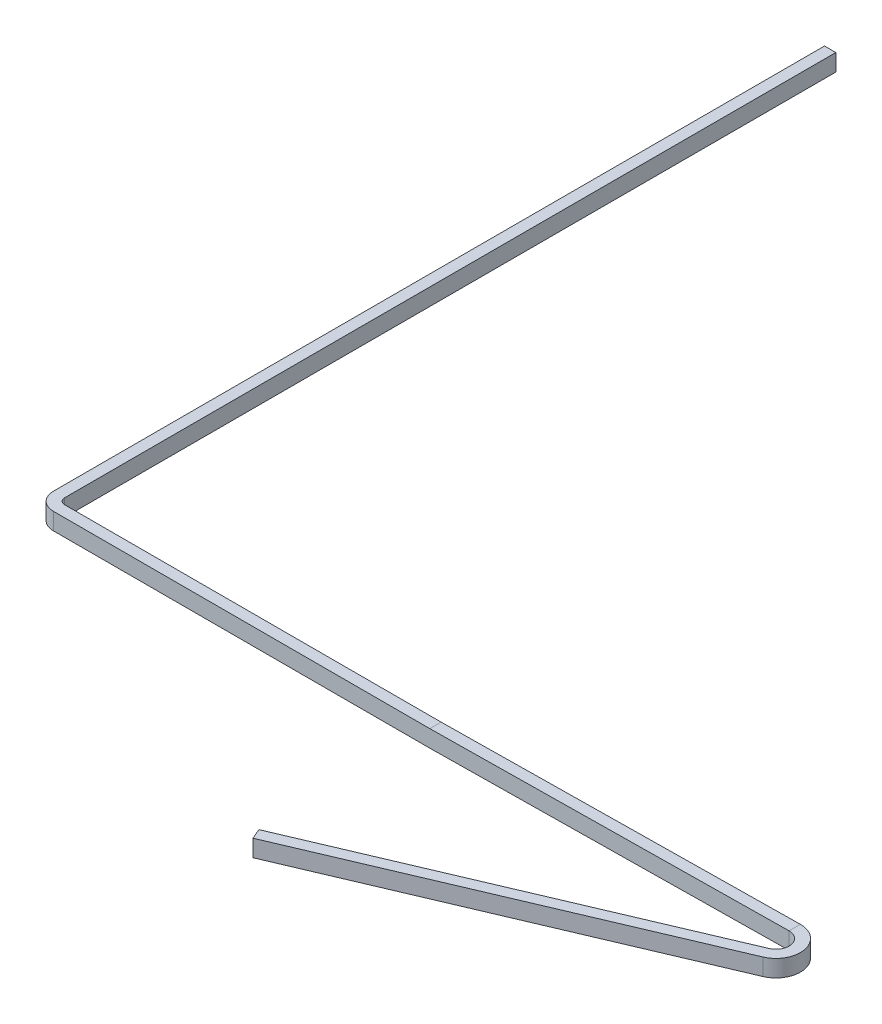
ISO-10303-21;
HEADER;
FILE_DESCRIPTION(('STEP AP214'),'2;1');
FILE_NAME('part.step','',(''),(''),'','','');
FILE_SCHEMA(('AUTOMOTIVE_DESIGN { 1 0 10303 214 1 1 1 1 }'));
ENDSEC;
DATA;
#1=APPLICATION_CONTEXT('core data for automotive mechanical design processes');
#2=APPLICATION_PROTOCOL_DEFINITION('international standard','automotive_design',2000,#1);
#3=PRODUCT_CONTEXT('',#1,'mechanical');
#4=PRODUCT('Part','Part','',(#3));
#5=PRODUCT_RELATED_PRODUCT_CATEGORY('part','',(#4));
#6=PRODUCT_DEFINITION_FORMATION('','',#4);
#7=PRODUCT_DEFINITION_CONTEXT('part definition',#1,'design');
#8=PRODUCT_DEFINITION('design','',#6,#7);
#9=PRODUCT_DEFINITION_SHAPE('','',#8);
#10=(LENGTH_UNIT() NAMED_UNIT(*) SI_UNIT(.MILLI.,.METRE.));
#11=(NAMED_UNIT(*) PLANE_ANGLE_UNIT() SI_UNIT($,.RADIAN.));
#12=(NAMED_UNIT(*) SI_UNIT($,.STERADIAN.) SOLID_ANGLE_UNIT());
#13=UNCERTAINTY_MEASURE_WITH_UNIT(LENGTH_MEASURE(1.E-05),#10,'distance_accuracy_value','');
#14=(GEOMETRIC_REPRESENTATION_CONTEXT(3) GLOBAL_UNCERTAINTY_ASSIGNED_CONTEXT((#13)) GLOBAL_UNIT_ASSIGNED_CONTEXT((#10,
#11,#12)) REPRESENTATION_CONTEXT('',''));
#15=CARTESIAN_POINT('',(0.,0.,0.));
#16=DIRECTION('',(0.,0.,1.));
#17=DIRECTION('',(1.,0.,0.));
#18=AXIS2_PLACEMENT_3D('',#15,#16,#17);
#19=CARTESIAN_POINT('',(0.31,-0.225,20.64));
#20=DIRECTION('',(0.,0.,-1.));
#21=DIRECTION('',(0.,1.,0.));
#22=AXIS2_PLACEMENT_3D('',#19,#20,#21);
#23=PLANE('',#22);
#24=DIRECTION('',(1.,0.,0.));
#25=VECTOR('',#24,1.);
#26=CARTESIAN_POINT('',(5.08070751918471,-0.225,20.64));
#27=LINE('',#26,#25);
#28=CARTESIAN_POINT('',(0.31,-0.225,20.64));
#29=VERTEX_POINT('',#28);
#30=CARTESIAN_POINT('',(10.3114150383694,-0.225,20.64));
#31=VERTEX_POINT('',#30);
#32=EDGE_CURVE('E291',#29,#31,#27,.T.);
#33=ORIENTED_EDGE('',*,*,#32,.F.);
#34=DIRECTION('',(0.,-1.,0.));
#35=VECTOR('',#34,1.);
#36=CARTESIAN_POINT('',(0.31,0.,20.64));
#37=LINE('',#36,#35);
#38=CARTESIAN_POINT('',(0.31,0.225,20.64));
#39=VERTEX_POINT('',#38);
#40=EDGE_CURVE('E315',#39,#29,#37,.T.);
#41=ORIENTED_EDGE('',*,*,#40,.F.);
#42=DIRECTION('',(-1.,0.,0.));
#43=VECTOR('',#42,1.);
#44=CARTESIAN_POINT('',(5.07929248081528,0.225,20.64));
#45=LINE('',#44,#43);
#46=CARTESIAN_POINT('',(10.3085849616306,0.225,20.64));
#47=VERTEX_POINT('',#46);
#48=EDGE_CURVE('E263',#47,#39,#45,.T.);
#49=ORIENTED_EDGE('',*,*,#48,.F.);
#50=DIRECTION('',(-0.999920898591871,-0.0125776213659355,0.));
#51=VECTOR('',#50,1.);
#52=CARTESIAN_POINT('',(15.0785849616306,0.285,20.64));
#53=LINE('',#52,#51);
#54=CARTESIAN_POINT('',(19.8485849617664,0.345,20.639999756233));
#55=VERTEX_POINT('',#54);
#56=EDGE_CURVE('E132',#55,#47,#53,.T.);
#57=ORIENTED_EDGE('',*,*,#56,.F.);
#58=CARTESIAN_POINT('',(19.8514150297148,-0.105,20.6400026896173));
#59=CARTESIAN_POINT('',(19.8512950706655,-0.0862500013329274,20.6400023026352));
#60=CARTESIAN_POINT('',(19.851175317221,-0.0675000013489172,20.6400019574207));
#61=CARTESIAN_POINT('',(19.8509362383301,-0.0300000013808963,20.6400013476113));
#62=CARTESIAN_POINT('',(19.8508169128837,-0.0112500013968861,20.6400010830163));
#63=CARTESIAN_POINT('',(19.8505787067604,0.0262499986465403,20.6400006315296));
#64=CARTESIAN_POINT('',(19.8504598260834,0.044999998705956,20.6400004446379));
#65=CARTESIAN_POINT('',(19.8502224546437,0.0824999985218841,20.6400001630369));
#66=CARTESIAN_POINT('',(19.8501039638809,0.101249998278396,20.6400000683275));
#67=CARTESIAN_POINT('',(19.8498676054621,0.138749997872026,20.6399999156173));
#68=CARTESIAN_POINT('',(19.8497497378059,0.157499997709143,20.6399998576166));
#69=CARTESIAN_POINT('',(19.8495147857296,0.194999997613875,20.6399997359405));
#70=CARTESIAN_POINT('',(19.8493977013094,0.213749997681489,20.6399996722651));
#71=CARTESIAN_POINT('',(19.8491642557706,0.251249997758681,20.6399995503159));
#72=CARTESIAN_POINT('',(19.8490478946518,0.269999997768257,20.6399994920422));
#73=CARTESIAN_POINT('',(19.8488158907957,0.307499997787412,20.6399993786078));
#74=CARTESIAN_POINT('',(19.8487002480582,0.326249997796989,20.6399993234472));
#75=CARTESIAN_POINT('',(19.8485849620382,0.345,20.6399992686989));
#76=B_SPLINE_CURVE_WITH_KNOTS('',3,(#58,#59,#60,#61,#62,#63,#64,#65,#66,#67,#68,#69,#70,#71,#72,
#73,#74,#75),.UNSPECIFIED.,.F.,.F.,(4,2,2,2,2,2,2,2,4),(0.,0.0562511472153029,0.112502286240999,
0.16875341701549,0.225004539473336,0.281255650382218,0.337506747259881,0.393757830457787,
0.450008900322446),.UNSPECIFIED.);
#77=CARTESIAN_POINT('',(19.8514150353765,-0.105,20.6400011471427));
#78=VERTEX_POINT('',#77);
#79=EDGE_CURVE('E120',#55,#78,#76,.F.);
#80=ORIENTED_EDGE('',*,*,#79,.T.);
#81=DIRECTION('',(0.999920898591871,0.0125776213659355,0.));
#82=VECTOR('',#81,1.);
#83=CARTESIAN_POINT('',(15.0814150383694,-0.165,20.64));
#84=LINE('',#83,#82);
#85=EDGE_CURVE('E147',#31,#78,#84,.T.);
#86=ORIENTED_EDGE('',*,*,#85,.F.);
#87=EDGE_LOOP('',(#33,#41,#49,#57,#80,#86));
#88=FACE_BOUND('',#87,.T.);
#89=ADVANCED_FACE('F15',(#88),#23,.T.);
#90=CARTESIAN_POINT('',(0.31,-0.27,20.48));
#91=DIRECTION('',(0.,1.,0.));
#92=DIRECTION('',(0.,0.,1.));
#93=AXIS2_PLACEMENT_3D('',#90,#91,#92);
#94=CYLINDRICAL_SURFACE('',#93,0.160000000000002);
#95=DIRECTION('',(0.,-1.,0.));
#96=VECTOR('',#95,1.);
#97=CARTESIAN_POINT('',(0.15,0.,20.48));
#98=LINE('',#97,#96);
#99=CARTESIAN_POINT('',(0.149999999999994,0.225,20.48));
#100=VERTEX_POINT('',#99);
#101=CARTESIAN_POINT('',(0.150000000000025,-0.225,20.48));
#102=VERTEX_POINT('',#101);
#103=EDGE_CURVE('E99',#100,#102,#98,.T.);
#104=ORIENTED_EDGE('',*,*,#103,.F.);
#105=CARTESIAN_POINT('',(0.31,0.225,20.48));
#106=DIRECTION('',(0.,1.,0.));
#107=DIRECTION('',(0.,0.,1.));
#108=AXIS2_PLACEMENT_3D('',#105,#106,#107);
#109=CIRCLE('',#108,0.160000000000002);
#110=EDGE_CURVE('E492',#39,#100,#109,.F.);
#111=ORIENTED_EDGE('',*,*,#110,.F.);
#112=ORIENTED_EDGE('',*,*,#40,.T.);
#113=CARTESIAN_POINT('',(0.31,-0.225,20.48));
#114=DIRECTION('',(0.,1.,0.));
#115=DIRECTION('',(0.,0.,1.));
#116=AXIS2_PLACEMENT_3D('',#113,#114,#115);
#117=CIRCLE('',#116,0.160000000000002);
#118=EDGE_CURVE('E19',#102,#29,#117,.T.);
#119=ORIENTED_EDGE('',*,*,#118,.F.);
#120=EDGE_LOOP('',(#104,#111,#112,#119));
#121=FACE_BOUND('',#120,.T.);
#122=ADVANCED_FACE('F469',(#121),#94,.F.);
#123=CARTESIAN_POINT('',(0.15,-0.225,0.));
#124=DIRECTION('',(1.,0.,0.));
#125=DIRECTION('',(0.,1.,0.));
#126=AXIS2_PLACEMENT_3D('',#123,#124,#125);
#127=PLANE('',#126);
#128=DIRECTION('',(0.,-1.,0.));
#129=VECTOR('',#128,1.);
#130=CARTESIAN_POINT('',(0.15,0.,0.));
#131=LINE('',#130,#129);
#132=CARTESIAN_POINT('',(0.149999999999991,0.225,0.));
#133=VERTEX_POINT('',#132);
#134=CARTESIAN_POINT('',(0.150000000000025,-0.225,0.));
#135=VERTEX_POINT('',#134);
#136=EDGE_CURVE('E111',#133,#135,#131,.T.);
#137=ORIENTED_EDGE('',*,*,#136,.F.);
#138=DIRECTION('',(0.,0.,-1.));
#139=VECTOR('',#138,1.);
#140=CARTESIAN_POINT('',(0.149999999999987,0.225,10.47));
#141=LINE('',#140,#139);
#142=EDGE_CURVE('E308',#100,#133,#141,.T.);
#143=ORIENTED_EDGE('',*,*,#142,.F.);
#144=ORIENTED_EDGE('',*,*,#103,.T.);
#145=DIRECTION('',(0.,0.,1.));
#146=VECTOR('',#145,1.);
#147=CARTESIAN_POINT('',(0.150000000000049,-0.225,10.47));
#148=LINE('',#147,#146);
#149=EDGE_CURVE('E282',#135,#102,#148,.T.);
#150=ORIENTED_EDGE('',*,*,#149,.F.);
#151=EDGE_LOOP('',(#137,#143,#144,#150));
#152=FACE_BOUND('',#151,.T.);
#153=ADVANCED_FACE('F460',(#152),#127,.T.);
#154=CARTESIAN_POINT('',(0.15,-0.225,0.));
#155=DIRECTION('',(0.,0.,-1.));
#156=DIRECTION('',(-1.,0.,0.));
#157=AXIS2_PLACEMENT_3D('',#154,#155,#156);
#158=PLANE('',#157);
#159=DIRECTION('',(0.,-1.,0.));
#160=VECTOR('',#159,1.);
#161=CARTESIAN_POINT('',(-0.15,0.,0.));
#162=LINE('',#161,#160);
#163=CARTESIAN_POINT('',(-0.15,0.225,0.));
#164=VERTEX_POINT('',#163);
#165=CARTESIAN_POINT('',(-0.15,-0.225,0.));
#166=VERTEX_POINT('',#165);
#167=EDGE_CURVE('E296',#164,#166,#162,.T.);
#168=ORIENTED_EDGE('',*,*,#167,.F.);
#169=DIRECTION('',(-1.,0.,0.));
#170=VECTOR('',#169,1.);
#171=CARTESIAN_POINT('',(5.07929248081528,0.225,0.));
#172=LINE('',#171,#170);
#173=EDGE_CURVE('E304',#133,#164,#172,.T.);
#174=ORIENTED_EDGE('',*,*,#173,.F.);
#175=ORIENTED_EDGE('',*,*,#136,.T.);
#176=DIRECTION('',(1.,0.,0.));
#177=VECTOR('',#176,1.);
#178=CARTESIAN_POINT('',(5.08070751918471,-0.225,0.));
#179=LINE('',#178,#177);
#180=EDGE_CURVE('E285',#166,#135,#179,.T.);
#181=ORIENTED_EDGE('',*,*,#180,.F.);
#182=EDGE_LOOP('',(#168,#174,#175,#181));
#183=FACE_BOUND('',#182,.T.);
#184=ADVANCED_FACE('F450',(#183),#158,.T.);
#185=CARTESIAN_POINT('',(-0.15,0.225,0.));
#186=DIRECTION('',(-1.,0.,0.));
#187=DIRECTION('',(0.,-1.,0.));
#188=AXIS2_PLACEMENT_3D('',#185,#186,#187);
#189=PLANE('',#188);
#190=DIRECTION('',(0.,0.,1.));
#191=VECTOR('',#190,1.);
#192=CARTESIAN_POINT('',(-0.15,0.225,10.47));
#193=LINE('',#192,#191);
#194=CARTESIAN_POINT('',(-0.15,0.225,20.48));
#195=VERTEX_POINT('',#194);
#196=EDGE_CURVE('E307',#164,#195,#193,.T.);
#197=ORIENTED_EDGE('',*,*,#196,.F.);
#198=ORIENTED_EDGE('',*,*,#167,.T.);
#199=DIRECTION('',(0.,0.,-1.));
#200=VECTOR('',#199,1.);
#201=CARTESIAN_POINT('',(-0.15,-0.225,10.47));
#202=LINE('',#201,#200);
#203=CARTESIAN_POINT('',(-0.15,-0.225,20.48));
#204=VERTEX_POINT('',#203);
#205=EDGE_CURVE('E288',#204,#166,#202,.T.);
#206=ORIENTED_EDGE('',*,*,#205,.F.);
#207=DIRECTION('',(0.,1.,0.));
#208=VECTOR('',#207,1.);
#209=CARTESIAN_POINT('',(-0.15,0.,20.48));
#210=LINE('',#209,#208);
#211=EDGE_CURVE('E299',#204,#195,#210,.T.);
#212=ORIENTED_EDGE('',*,*,#211,.T.);
#213=EDGE_LOOP('',(#197,#198,#206,#212));
#214=FACE_BOUND('',#213,.T.);
#215=ADVANCED_FACE('F440',(#214),#189,.T.);
#216=CARTESIAN_POINT('',(-0.15,-0.225,20.94));
#217=DIRECTION('',(0.,-1.,0.));
#218=DIRECTION('',(0.,0.,-1.));
#219=AXIS2_PLACEMENT_3D('',#216,#217,#218);
#220=PLANE('',#219);
#221=ORIENTED_EDGE('',*,*,#149,.T.);
#222=ORIENTED_EDGE('',*,*,#118,.T.);
#223=ORIENTED_EDGE('',*,*,#32,.T.);
#224=DIRECTION('',(0.,0.,-1.));
#225=VECTOR('',#224,1.);
#226=CARTESIAN_POINT('',(10.3114150383694,-0.225,20.79));
#227=LINE('',#226,#225);
#228=CARTESIAN_POINT('',(10.3114150383695,-0.225,20.94));
#229=VERTEX_POINT('',#228);
#230=EDGE_CURVE('E151',#229,#31,#227,.T.);
#231=ORIENTED_EDGE('',*,*,#230,.F.);
#232=DIRECTION('',(1.,0.,0.));
#233=VECTOR('',#232,1.);
#234=CARTESIAN_POINT('',(10.0807075191847,-0.225,20.94));
#235=LINE('',#234,#233);
#236=CARTESIAN_POINT('',(0.310000000000003,-0.225,20.94));
#237=VERTEX_POINT('',#236);
#238=EDGE_CURVE('E163',#237,#229,#235,.T.);
#239=ORIENTED_EDGE('',*,*,#238,.F.);
#240=CARTESIAN_POINT('',(0.310000000000006,-0.225,20.48));
#241=DIRECTION('',(0.,1.,0.));
#242=DIRECTION('',(0.,0.,1.));
#243=AXIS2_PLACEMENT_3D('',#240,#241,#242);
#244=CIRCLE('',#243,0.460000000000002);
#245=EDGE_CURVE('E499',#204,#237,#244,.T.);
#246=ORIENTED_EDGE('',*,*,#245,.F.);
#247=ORIENTED_EDGE('',*,*,#205,.T.);
#248=ORIENTED_EDGE('',*,*,#180,.T.);
#249=EDGE_LOOP('',(#221,#222,#223,#231,#239,#246,#247,#248));
#250=FACE_BOUND('',#249,.T.);
#251=ADVANCED_FACE('F431',(#250),#220,.T.);
#252=CARTESIAN_POINT('',(10.3114150383694,-0.225,20.64));
#253=DIRECTION('',(0.0125776213659355,-0.999920898591871,0.));
#254=DIRECTION('',(0.999920898591871,0.0125776213659355,0.));
#255=AXIS2_PLACEMENT_3D('',#252,#253,#254);
#256=PLANE('',#255);
#257=DIRECTION('',(0.999920898591871,0.0125776213659354,0.));
#258=VECTOR('',#257,1.);
#259=CARTESIAN_POINT('',(10.3114150383695,-0.225,20.94));
#260=LINE('',#259,#258);
#261=CARTESIAN_POINT('',(19.8514150348993,-0.105000000000001,20.94000130547));
#262=VERTEX_POINT('',#261);
#263=EDGE_CURVE('E145',#229,#262,#260,.T.);
#264=ORIENTED_EDGE('',*,*,#263,.F.);
#265=ORIENTED_EDGE('',*,*,#230,.T.);
#266=ORIENTED_EDGE('',*,*,#85,.T.);
#267=DIRECTION('',(0.,0.,1.));
#268=VECTOR('',#267,1.);
#269=CARTESIAN_POINT('',(19.8514150383694,-0.105,20.79));
#270=LINE('',#269,#268);
#271=EDGE_CURVE('E141',#78,#262,#270,.T.);
#272=ORIENTED_EDGE('',*,*,#271,.T.);
#273=EDGE_LOOP('',(#264,#265,#266,#272));
#274=FACE_BOUND('',#273,.T.);
#275=ADVANCED_FACE('F143',(#274),#256,.T.);
#276=CARTESIAN_POINT('',(19.8485849616305,0.345,20.64));
#277=DIRECTION('',(-0.0125776213659355,0.999920898591871,0.));
#278=DIRECTION('',(-0.999920898591871,-0.0125776213659355,0.));
#279=AXIS2_PLACEMENT_3D('',#276,#277,#278);
#280=PLANE('',#279);
#281=ORIENTED_EDGE('',*,*,#56,.T.);
#282=DIRECTION('',(0.,0.,-1.));
#283=VECTOR('',#282,1.);
#284=CARTESIAN_POINT('',(10.3085849616306,0.225,10.47));
#285=LINE('',#284,#283);
#286=CARTESIAN_POINT('',(10.3085849616309,0.225000000000004,20.94));
#287=VERTEX_POINT('',#286);
#288=EDGE_CURVE('E265',#287,#47,#285,.T.);
#289=ORIENTED_EDGE('',*,*,#288,.F.);
#290=DIRECTION('',(-0.999920898591871,-0.0125776213659354,0.));
#291=VECTOR('',#290,1.);
#292=CARTESIAN_POINT('',(19.8485849616305,0.345,20.94));
#293=LINE('',#292,#291);
#294=CARTESIAN_POINT('',(19.8485849616571,0.345,20.9399998339574));
#295=VERTEX_POINT('',#294);
#296=EDGE_CURVE('E164',#295,#287,#293,.T.);
#297=ORIENTED_EDGE('',*,*,#296,.F.);
#298=DIRECTION('',(0.,0.,-1.));
#299=VECTOR('',#298,1.);
#300=CARTESIAN_POINT('',(19.8485849616305,0.345,20.79));
#301=LINE('',#300,#299);
#302=EDGE_CURVE('E259',#295,#55,#301,.T.);
#303=ORIENTED_EDGE('',*,*,#302,.T.);
#304=EDGE_LOOP('',(#281,#289,#297,#303));
#305=FACE_BOUND('',#304,.T.);
#306=ADVANCED_FACE('F267',(#305),#280,.T.);
#307=CARTESIAN_POINT('',(-0.15,0.225,0.));
#308=DIRECTION('',(0.,1.,0.));
#309=DIRECTION('',(0.,0.,1.));
#310=AXIS2_PLACEMENT_3D('',#307,#308,#309);
#311=PLANE('',#310);
#312=ORIENTED_EDGE('',*,*,#196,.T.);
#313=CARTESIAN_POINT('',(0.310000000000006,0.225,20.48));
#314=DIRECTION('',(0.,1.,0.));
#315=DIRECTION('',(0.,0.,1.));
#316=AXIS2_PLACEMENT_3D('',#313,#314,#315);
#317=CIRCLE('',#316,0.460000000000002);
#318=CARTESIAN_POINT('',(0.310000000000003,0.225000000000001,20.94));
#319=VERTEX_POINT('',#318);
#320=EDGE_CURVE('E281',#319,#195,#317,.F.);
#321=ORIENTED_EDGE('',*,*,#320,.F.);
#322=DIRECTION('',(-1.,0.,0.));
#323=VECTOR('',#322,1.);
#324=CARTESIAN_POINT('',(10.0807075191847,0.225000000000002,20.94));
#325=LINE('',#324,#323);
#326=EDGE_CURVE('E507',#287,#319,#325,.T.);
#327=ORIENTED_EDGE('',*,*,#326,.F.);
#328=ORIENTED_EDGE('',*,*,#288,.T.);
#329=ORIENTED_EDGE('',*,*,#48,.T.);
#330=ORIENTED_EDGE('',*,*,#110,.T.);
#331=ORIENTED_EDGE('',*,*,#142,.T.);
#332=ORIENTED_EDGE('',*,*,#173,.T.);
#333=EDGE_LOOP('',(#312,#321,#327,#328,#329,#330,#331,#332));
#334=FACE_BOUND('',#333,.T.);
#335=ADVANCED_FACE('F405',(#334),#311,.T.);
#336=CARTESIAN_POINT('',(0.310000000000006,-0.27,20.48));
#337=DIRECTION('',(0.,1.,0.));
#338=DIRECTION('',(0.,0.,1.));
#339=AXIS2_PLACEMENT_3D('',#336,#337,#338);
#340=CYLINDRICAL_SURFACE('',#339,0.460000000000002);
#341=ORIENTED_EDGE('',*,*,#320,.T.);
#342=ORIENTED_EDGE('',*,*,#211,.F.);
#343=ORIENTED_EDGE('',*,*,#245,.T.);
#344=DIRECTION('',(0.,-1.,0.));
#345=VECTOR('',#344,1.);
#346=CARTESIAN_POINT('',(0.31,0.06,20.94));
#347=LINE('',#346,#345);
#348=EDGE_CURVE('E345',#319,#237,#347,.T.);
#349=ORIENTED_EDGE('',*,*,#348,.F.);
#350=EDGE_LOOP('',(#341,#342,#343,#349));
#351=FACE_BOUND('',#350,.T.);
#352=ADVANCED_FACE('F397',(#351),#340,.T.);
#353=CARTESIAN_POINT('',(0.31,0.345,20.94));
#354=DIRECTION('',(0.,0.,1.));
#355=DIRECTION('',(0.,-1.,0.));
#356=AXIS2_PLACEMENT_3D('',#353,#354,#355);
#357=PLANE('',#356);
#358=ORIENTED_EDGE('',*,*,#326,.T.);
#359=ORIENTED_EDGE('',*,*,#348,.T.);
#360=ORIENTED_EDGE('',*,*,#238,.T.);
#361=ORIENTED_EDGE('',*,*,#263,.T.);
#362=CARTESIAN_POINT('',(19.8485849617111,0.345,20.9399995018721));
#363=CARTESIAN_POINT('',(19.8487075588649,0.326250004127953,20.939999539254));
#364=CARTESIAN_POINT('',(19.8488295242557,0.307500004125915,20.9399995765735));
#365=CARTESIAN_POINT('',(19.8490721803583,0.270000004121835,20.9399996541864));
#366=CARTESIAN_POINT('',(19.8491928710706,0.251250004119797,20.9399996944798));
#367=CARTESIAN_POINT('',(19.8494329667169,0.213750004259048,20.9399997811396));
#368=CARTESIAN_POINT('',(19.8495523716515,0.19500000440034,20.939999827506));
#369=CARTESIAN_POINT('',(19.849789746067,0.15750000409323,20.9399999112957));
#370=CARTESIAN_POINT('',(19.8499077155486,0.138750003644832,20.939999948719));
#371=CARTESIAN_POINT('',(19.8501426324769,0.101250002889357,20.9400000732173));
#372=CARTESIAN_POINT('',(19.8502595799239,0.0825000025822832,20.9400001602923));
#373=CARTESIAN_POINT('',(19.8504927427663,0.0450000023338647,20.9400004204614));
#374=CARTESIAN_POINT('',(19.8506089581618,0.0262500023925214,20.9400005935555));
#375=CARTESIAN_POINT('',(19.8508405952031,-0.0112499975812387,20.9400010162204));
#376=CARTESIAN_POINT('',(19.8509560168491,-0.0299999976136543,20.9400012657912));
#377=CARTESIAN_POINT('',(19.8511860926111,-0.0674999976784867,20.9400018433446));
#378=CARTESIAN_POINT('',(19.8513007467273,-0.0862499977109022,20.9400021713271));
#379=CARTESIAN_POINT('',(19.8514150302024,-0.105,20.940002539483));
#380=B_SPLINE_CURVE_WITH_KNOTS('',3,(#362,#363,#364,#365,#366,#367,#368,#369,#370,#371,#372,
#373,#374,#375,#376,#377,#378,#379),.UNSPECIFIED.,.F.,.F.,(4,2,2,2,2,2,2,2,4),(0.,
0.056251189995951,0.112502355248133,0.168753495363266,0.225004609997177,0.281255705028135,
0.337506785310365,0.393757851158471,0.450008902882735),.UNSPECIFIED.);
#381=EDGE_CURVE('E159',#295,#262,#380,.T.);
#382=ORIENTED_EDGE('',*,*,#381,.F.);
#383=ORIENTED_EDGE('',*,*,#296,.T.);
#384=EDGE_LOOP('',(#358,#359,#360,#361,#382,#383));
#385=FACE_BOUND('',#384,.T.);
#386=ADVANCED_FACE('F157',(#385),#357,.T.);
#387=CARTESIAN_POINT('',(10.4212086650717,0.345,20.64));
#388=DIRECTION('',(0.,1.,0.));
#389=DIRECTION('',(0.,0.,1.));
#390=AXIS2_PLACEMENT_3D('',#387,#388,#389);
#391=PLANE('',#390);
#392=DIRECTION('',(1.,0.,0.));
#393=VECTOR('',#392,1.);
#394=CARTESIAN_POINT('',(10.4212086650717,0.345,20.9399995018721));
#395=LINE('',#394,#393);
#396=CARTESIAN_POINT('',(19.849999999998,0.345,20.94));
#397=VERTEX_POINT('',#396);
#398=EDGE_CURVE('E174',#397,#295,#395,.F.);
#399=ORIENTED_EDGE('',*,*,#398,.F.);
#400=CARTESIAN_POINT('',(19.9868982813718,0.345,21.6121162221271));
#401=CARTESIAN_POINT('',(20.0232168228054,0.345,21.5967167026278));
#402=CARTESIAN_POINT('',(20.0567935222807,0.345,21.5749093463835));
#403=CARTESIAN_POINT('',(20.1150871937299,0.345,21.521629948673));
#404=CARTESIAN_POINT('',(20.1398090794989,0.345,21.4901632854997));
#405=CARTESIAN_POINT('',(20.1770496477913,0.345,21.4207206403007));
#406=CARTESIAN_POINT('',(20.1895783151175,0.345,21.3827500142692));
#407=CARTESIAN_POINT('',(20.2016835784681,0.345,21.3049572144616));
#408=CARTESIAN_POINT('',(20.2013107429841,0.345,21.2651428803673));
#409=CARTESIAN_POINT('',(20.1870501990881,0.345,21.1877618490351));
#410=CARTESIAN_POINT('',(20.17308647886,0.345,21.1502090549943));
#411=CARTESIAN_POINT('',(20.1339141892116,0.345,21.081944035613));
#412=CARTESIAN_POINT('',(20.1087884775296,0.345,21.0511838609031));
#413=CARTESIAN_POINT('',(20.0493423644816,0.345,20.9995690520427));
#414=CARTESIAN_POINT('',(20.0149443224734,0.345,20.9788023863395));
#415=CARTESIAN_POINT('',(19.9578545314176,0.345,20.9563095378121));
#416=CARTESIAN_POINT('',(19.9367640847152,0.345,20.950222690725));
#417=CARTESIAN_POINT('',(19.8937994275223,0.345,20.9420615933635));
#418=CARTESIAN_POINT('',(19.8719244702851,0.345,20.9399912753899));
#419=CARTESIAN_POINT('',(19.8499999999982,0.345,20.94));
#420=B_SPLINE_CURVE_WITH_KNOTS('',3,(#400,#401,#402,#403,#404,#405,#406,#407,#408,#409,#410,
#411,#412,#413,#414,#415,#416,#417,#418,#419),.UNSPECIFIED.,.F.,.F.,(4,2,2,2,2,2,2,2,2,4),(0.,
0.117848498601358,0.235631497928444,0.353317965559581,0.470543203933753,0.588427855554383,
0.705451679315343,0.823487579408107,0.889004181516192,0.954584894011041),.UNSPECIFIED.);
#421=CARTESIAN_POINT('',(19.9868982813718,0.345,21.6121162221271));
#422=VERTEX_POINT('',#421);
#423=EDGE_CURVE('E226',#422,#397,#420,.T.);
#424=ORIENTED_EDGE('',*,*,#423,.F.);
#425=DIRECTION('',(0.920332063220277,0.,-0.391137946776719));
#426=VECTOR('',#425,1.);
#427=CARTESIAN_POINT('',(15.2341137946777,0.345,23.632033206322));
#428=LINE('',#427,#426);
#429=CARTESIAN_POINT('',(10.4813293079835,0.345,25.651950190517));
#430=VERTEX_POINT('',#429);
#431=EDGE_CURVE('E176',#430,#422,#428,.T.);
#432=ORIENTED_EDGE('',*,*,#431,.F.);
#433=DIRECTION('',(0.391137946776799,0.,0.920332063220243));
#434=VECTOR('',#433,1.);
#435=CARTESIAN_POINT('',(10.4813293079835,0.345,25.651950190517));
#436=LINE('',#435,#434);
#437=CARTESIAN_POINT('',(10.5986706920165,0.345,25.928049809483));
#438=VERTEX_POINT('',#437);
#439=EDGE_CURVE('E235',#430,#438,#436,.T.);
#440=ORIENTED_EDGE('',*,*,#439,.T.);
#441=DIRECTION('',(-0.920332063220278,0.,0.391137946776717));
#442=VECTOR('',#441,1.);
#443=CARTESIAN_POINT('',(15.3514551787107,0.345,23.9081328252881));
#444=LINE('',#443,#442);
#445=CARTESIAN_POINT('',(20.1042396654049,0.345,21.8882158410932));
#446=VERTEX_POINT('',#445);
#447=EDGE_CURVE('E342',#446,#438,#444,.T.);
#448=ORIENTED_EDGE('',*,*,#447,.F.);
#449=CARTESIAN_POINT('',(19.850000000026,0.345,20.64));
#450=CARTESIAN_POINT('',(19.8883606594828,0.345,20.6400043187614));
#451=CARTESIAN_POINT('',(19.926620938542,0.345,20.6434038848513));
#452=CARTESIAN_POINT('',(20.0019415597661,0.345,20.6568465049347));
#453=CARTESIAN_POINT('',(20.0390023087995,0.345,20.6668872809927));
#454=CARTESIAN_POINT('',(20.1435320283095,0.345,20.7055004010905));
#455=CARTESIAN_POINT('',(20.208144025218,0.345,20.7426203853392));
#456=CARTESIAN_POINT('',(20.2925656869604,0.345,20.8125639201323));
#457=CARTESIAN_POINT('',(20.3186383891348,0.345,20.8382803707416));
#458=CARTESIAN_POINT('',(20.366172077196,0.345,20.8937547333654));
#459=CARTESIAN_POINT('',(20.3876291528647,0.345,20.9235160375024));
#460=CARTESIAN_POINT('',(20.4253439325151,0.345,20.9861354728086));
#461=CARTESIAN_POINT('',(20.4416047914697,0.345,21.0189917090838));
#462=CARTESIAN_POINT('',(20.468435932204,0.345,21.0869629086113));
#463=CARTESIAN_POINT('',(20.4790028885583,0.345,21.1220791784254));
#464=CARTESIAN_POINT('',(20.5012540661703,0.345,21.2293255295778));
#465=CARTESIAN_POINT('',(20.5036128932802,0.345,21.3035587484733));
#466=CARTESIAN_POINT('',(20.4841916893155,0.345,21.4485985844396));
#467=CARTESIAN_POINT('',(20.4624709915497,0.345,21.5194131774059));
#468=CARTESIAN_POINT('',(20.4129741327938,0.345,21.6169868626586));
#469=CARTESIAN_POINT('',(20.393556291536,0.345,21.6481653519295));
#470=CARTESIAN_POINT('',(20.3497359898602,0.345,21.7068684213519));
#471=CARTESIAN_POINT('',(20.3253277505515,0.345,21.7343887037683));
#472=CARTESIAN_POINT('',(20.2705486134915,0.345,21.786695655823));
#473=CARTESIAN_POINT('',(20.2398905989785,0.345,21.8111822524944));
#474=CARTESIAN_POINT('',(20.1747234185479,0.345,21.8542980704158));
#475=CARTESIAN_POINT('',(20.1402156647679,0.345,21.872929429938));
#476=CARTESIAN_POINT('',(20.1042396654049,0.345,21.8882158410932));
#477=B_SPLINE_CURVE_WITH_KNOTS('',3,(#449,#450,#451,#452,#453,#454,#455,#456,#457,#458,#459,
#460,#461,#462,#463,#464,#465,#466,#467,#468,#469,#470,#471,#472,#473,#474,#475,#476),
.UNSPECIFIED.,.F.,.F.,(4,2,2,2,2,2,2,2,2,2,2,2,2,4),(0.,0.114735445988993,0.229431558105984,
0.447998711036104,0.55744676310312,0.66698717421023,0.7764609490286,0.885998591003128,
1.10439143494144,1.32224734031182,1.43195857758863,1.54179758767083,1.65888211009806,
1.77592382464529),.UNSPECIFIED.);
#478=CARTESIAN_POINT('',(19.850000000026,0.345,20.64));
#479=VERTEX_POINT('',#478);
#480=EDGE_CURVE('E248',#479,#446,#477,.T.);
#481=ORIENTED_EDGE('',*,*,#480,.F.);
#482=DIRECTION('',(1.,0.,0.));
#483=VECTOR('',#482,1.);
#484=CARTESIAN_POINT('',(10.4212086650717,0.345,20.64));
#485=LINE('',#484,#483);
#486=EDGE_CURVE('E255',#55,#479,#485,.T.);
#487=ORIENTED_EDGE('',*,*,#486,.F.);
#488=ORIENTED_EDGE('',*,*,#302,.F.);
#489=EDGE_LOOP('',(#399,#424,#432,#440,#448,#481,#487,#488));
#490=FACE_BOUND('',#489,.T.);
#491=ADVANCED_FACE('F237',(#490),#391,.T.);
#492=CARTESIAN_POINT('',(10.5986706920165,-0.105,25.928049809483));
#493=DIRECTION('',(0.391137946776717,0.,0.920332063220278));
#494=DIRECTION('',(0.920332063220278,0.,-0.391137946776717));
#495=AXIS2_PLACEMENT_3D('',#492,#493,#494);
#496=PLANE('',#495);
#497=DIRECTION('',(0.,-1.,0.));
#498=VECTOR('',#497,1.);
#499=CARTESIAN_POINT('',(20.1042396654049,0.12,21.8882158410932));
#500=LINE('',#499,#498);
#501=CARTESIAN_POINT('',(20.1042396654049,-0.105,21.8882158410932));
#502=VERTEX_POINT('',#501);
#503=EDGE_CURVE('E254',#446,#502,#500,.T.);
#504=ORIENTED_EDGE('',*,*,#503,.F.);
#505=ORIENTED_EDGE('',*,*,#447,.T.);
#506=DIRECTION('',(0.,-1.,0.));
#507=VECTOR('',#506,1.);
#508=CARTESIAN_POINT('',(10.5986706920165,0.12,25.928049809483));
#509=LINE('',#508,#507);
#510=CARTESIAN_POINT('',(10.5986706920165,-0.105,25.928049809483));
#511=VERTEX_POINT('',#510);
#512=EDGE_CURVE('E338',#438,#511,#509,.T.);
#513=ORIENTED_EDGE('',*,*,#512,.T.);
#514=DIRECTION('',(-0.920332063220277,0.,0.391137946776719));
#515=VECTOR('',#514,1.);
#516=CARTESIAN_POINT('',(20.1042396654048,-0.105,21.8882158410932));
#517=LINE('',#516,#515);
#518=EDGE_CURVE('E185',#502,#511,#517,.T.);
#519=ORIENTED_EDGE('',*,*,#518,.F.);
#520=EDGE_LOOP('',(#504,#505,#513,#519));
#521=FACE_BOUND('',#520,.T.);
#522=ADVANCED_FACE('F242',(#521),#496,.T.);
#523=CARTESIAN_POINT('',(19.9868982813718,-0.105,21.6121162221271));
#524=DIRECTION('',(-0.391137946776719,0.,-0.920332063220277));
#525=DIRECTION('',(-0.920332063220277,0.,0.391137946776719));
#526=AXIS2_PLACEMENT_3D('',#523,#524,#525);
#527=PLANE('',#526);
#528=ORIENTED_EDGE('',*,*,#431,.T.);
#529=DIRECTION('',(0.,1.,0.));
#530=VECTOR('',#529,1.);
#531=CARTESIAN_POINT('',(19.9868982813718,0.12,21.6121162221271));
#532=LINE('',#531,#530);
#533=CARTESIAN_POINT('',(19.9868982813718,-0.105,21.6121162221271));
#534=VERTEX_POINT('',#533);
#535=EDGE_CURVE('E175',#534,#422,#532,.T.);
#536=ORIENTED_EDGE('',*,*,#535,.F.);
#537=DIRECTION('',(0.920332063220279,0.,-0.391137946776715));
#538=VECTOR('',#537,1.);
#539=CARTESIAN_POINT('',(10.4813293079835,-0.105,25.6519501905169));
#540=LINE('',#539,#538);
#541=CARTESIAN_POINT('',(10.4813293079835,-0.105,25.6519501905169));
#542=VERTEX_POINT('',#541);
#543=EDGE_CURVE('E182',#542,#534,#540,.T.);
#544=ORIENTED_EDGE('',*,*,#543,.F.);
#545=DIRECTION('',(0.,1.,0.));
#546=VECTOR('',#545,1.);
#547=CARTESIAN_POINT('',(10.4813293079835,0.12,25.651950190517));
#548=LINE('',#547,#546);
#549=EDGE_CURVE('E33',#542,#430,#548,.T.);
#550=ORIENTED_EDGE('',*,*,#549,.T.);
#551=EDGE_LOOP('',(#528,#536,#544,#550));
#552=FACE_BOUND('',#551,.T.);
#553=ADVANCED_FACE('F208',(#552),#527,.T.);
#554=CARTESIAN_POINT('',(19.8406713147014,0.345,20.9399987348184));
#555=CARTESIAN_POINT('',(19.8440167452947,0.345,20.9399986062334));
#556=CARTESIAN_POINT('',(19.8472032534262,0.345,20.9399988484349));
#557=CARTESIAN_POINT('',(19.8621487614918,0.345,20.9400050022732));
#558=CARTESIAN_POINT('',(19.870001593979,0.345,20.9404291023397));
#559=CARTESIAN_POINT('',(19.889915868963,0.345,20.9421399708764));
#560=CARTESIAN_POINT('',(19.8998334632571,0.345,20.9434218193108));
#561=CARTESIAN_POINT('',(19.9293659714026,0.345,20.9485321680291));
#562=CARTESIAN_POINT('',(19.948760688396,0.345,20.9536290289917));
#563=CARTESIAN_POINT('',(20.0052104506488,0.345,20.9737625398497));
#564=CARTESIAN_POINT('',(20.0404741867121,0.345,20.9936625385647));
#565=CARTESIAN_POINT('',(20.133302370079,0.345,21.0694892431176));
#566=CARTESIAN_POINT('',(20.1770098672595,0.345,21.1418453600298));
#567=CARTESIAN_POINT('',(20.2089065675115,0.345,21.2984454974239));
#568=CARTESIAN_POINT('',(20.196982448521,0.345,21.3821326817591));
#569=CARTESIAN_POINT('',(20.1226169077395,0.345,21.5235921065538));
#570=CARTESIAN_POINT('',(20.0605491717276,0.345,21.5808148482173));
#571=CARTESIAN_POINT('',(19.9868982813718,0.345,21.6121162221271));
#572=CARTESIAN_POINT('',(19.8406713147014,-0.105,20.9399987348184));
#573=CARTESIAN_POINT('',(19.8440167452947,-0.105,20.9399986062334));
#574=CARTESIAN_POINT('',(19.8472032534262,-0.105,20.9399988484349));
#575=CARTESIAN_POINT('',(19.8621487614918,-0.105,20.9400050022732));
#576=CARTESIAN_POINT('',(19.870001593979,-0.105,20.9404291023397));
#577=CARTESIAN_POINT('',(19.889915868963,-0.105,20.9421399708764));
#578=CARTESIAN_POINT('',(19.8998334632571,-0.105,20.9434218193108));
#579=CARTESIAN_POINT('',(19.9293659714026,-0.105,20.9485321680291));
#580=CARTESIAN_POINT('',(19.948760688396,-0.105,20.9536290289918));
#581=CARTESIAN_POINT('',(20.005210450649,-0.105,20.9737625398496));
#582=CARTESIAN_POINT('',(20.0404741867121,-0.105,20.9936625385647));
#583=CARTESIAN_POINT('',(20.133302370079,-0.105,21.0694892431176));
#584=CARTESIAN_POINT('',(20.1770098672595,-0.105,21.1418453600298));
#585=CARTESIAN_POINT('',(20.2089065675115,-0.105,21.2984454974239));
#586=CARTESIAN_POINT('',(20.196982448521,-0.105,21.3821326817591));
#587=CARTESIAN_POINT('',(20.1226169077395,-0.105,21.5235921065538));
#588=CARTESIAN_POINT('',(20.0605491717276,-0.105,21.5808148482173));
#589=CARTESIAN_POINT('',(19.9868982813718,-0.105,21.6121162221271));
#590=B_SPLINE_SURFACE_WITH_KNOTS('',1,3,((#554,#555,#556,#557,#558,#559,#560,#561,#562,#563,
#564,#565,#566,#567,#568,#569,#570,#571),(#572,#573,#574,#575,#576,#577,#578,#579,#580,#581,
#582,#583,#584,#585,#586,#587,#588,#589)),.UNSPECIFIED.,.F.,.F.,.F.,(2,2),(4,2,2,2,2,2,2,2,4),
(0.,1.),(-0.0008424153665,0.,0.00365936029408,0.00731872058815,0.0146374411763,0.02927488235261,
0.05854976470521,0.08782464705782,0.11709952941042),.UNSPECIFIED.);
#591=CARTESIAN_POINT('',(19.9868982813718,-0.105,21.6121162221271));
#592=CARTESIAN_POINT('',(20.0232168211909,-0.105,21.5967167023179));
#593=CARTESIAN_POINT('',(20.0567935214737,-0.105,21.5749093462286));
#594=CARTESIAN_POINT('',(20.1150871945365,-0.105,21.5216299488278));
#595=CARTESIAN_POINT('',(20.1398090811117,-0.105,21.4901632858092));
#596=CARTESIAN_POINT('',(20.1770496461799,-0.105,21.4207206399913));
#597=CARTESIAN_POINT('',(20.1895783094798,-0.105,21.3827500131869));
#598=CARTESIAN_POINT('',(20.2016835840836,-0.105,21.3049572155396));
#599=CARTESIAN_POINT('',(20.2013107638035,-0.105,21.265142884364));
#600=CARTESIAN_POINT('',(20.1870501781515,-0.105,21.187761845016));
#601=CARTESIAN_POINT('',(20.1730864005571,-0.105,21.1502090399629));
#602=CARTESIAN_POINT('',(20.1339142669427,-0.105,21.0819440505347));
#603=CARTESIAN_POINT('',(20.108788766687,-0.105,21.0511839164112));
#604=CARTESIAN_POINT('',(20.0493420728235,-0.105,20.9995689960545));
#605=CARTESIAN_POINT('',(20.0149432298777,-0.105,20.9788021765991));
#606=CARTESIAN_POINT('',(19.9580728508641,-0.105,20.9563954324406));
#607=CARTESIAN_POINT('',(19.9372164493173,-0.105,20.9503533202395));
#608=CARTESIAN_POINT('',(19.8947311237435,-0.105,20.9421952174238));
#609=CARTESIAN_POINT('',(19.8731015562721,-0.105,20.9400825783609));
#610=CARTESIAN_POINT('',(19.8514150309306,-0.105,20.9400025394854));
#611=B_SPLINE_CURVE_WITH_KNOTS('',3,(#591,#592,#593,#594,#595,#596,#597,#598,#599,#600,#601,
#602,#603,#604,#605,#606,#607,#608,#609,#610),.UNSPECIFIED.,.F.,.F.,(4,2,2,2,2,2,2,2,2,4),(0.,
0.117848498601361,0.235631497928458,0.3533179655596,0.470543203933742,0.588427855554368,
0.705451679315334,0.823487579408099,0.888304179757277,0.953176038595298),.UNSPECIFIED.);
#612=EDGE_CURVE('E172',#534,#262,#611,.T.);
#613=ORIENTED_EDGE('',*,*,#423,.T.);
#614=ORIENTED_EDGE('',*,*,#398,.T.);
#615=ORIENTED_EDGE('',*,*,#381,.T.);
#616=ORIENTED_EDGE('',*,*,#612,.F.);
#617=ORIENTED_EDGE('',*,*,#535,.T.);
#618=EDGE_LOOP('',(#613,#614,#615,#616,#617));
#619=FACE_BOUND('',#618,.T.);
#620=ADVANCED_FACE('F170',(#619),#590,.T.);
#621=CARTESIAN_POINT('',(19.8399656984318,-0.105,20.6399976256621));
#622=CARTESIAN_POINT('',(19.8430871098909,-0.105,20.6399974491859));
#623=CARTESIAN_POINT('',(19.8463635872147,-0.105,20.6399979446947));
#624=CARTESIAN_POINT('',(19.8664365079251,-0.105,20.640009289936));
#625=CARTESIAN_POINT('',(19.8871458173896,-0.105,20.6407969043451));
#626=CARTESIAN_POINT('',(19.9241294709313,-0.105,20.6439742316277));
#627=CARTESIAN_POINT('',(19.9425478603346,-0.105,20.6463548072916));
#628=CARTESIAN_POINT('',(19.9973939468904,-0.105,20.6558454549112));
#629=CARTESIAN_POINT('',(20.0334127070212,-0.105,20.6653110538418));
#630=CARTESIAN_POINT('',(20.1382479797766,-0.105,20.7027018597208));
#631=CARTESIAN_POINT('',(20.2037377753225,-0.105,20.7396590001917));
#632=CARTESIAN_POINT('',(20.3761329730039,-0.105,20.8804800229327));
#633=CARTESIAN_POINT('',(20.4573040391959,-0.105,21.0148556686266));
#634=CARTESIAN_POINT('',(20.516540768236,-0.105,21.3056844952159));
#635=CARTESIAN_POINT('',(20.4943959758246,-0.105,21.4611035518385));
#636=CARTESIAN_POINT('',(20.3562885429449,-0.105,21.7238139121712));
#637=CARTESIAN_POINT('',(20.2410198903513,-0.105,21.8300847181179));
#638=CARTESIAN_POINT('',(20.1042396654049,-0.105,21.8882158410932));
#639=CARTESIAN_POINT('',(19.8399656984318,0.345,20.6399976256621));
#640=CARTESIAN_POINT('',(19.8430871098909,0.345,20.6399974491859));
#641=CARTESIAN_POINT('',(19.8463635872147,0.345,20.6399979446947));
#642=CARTESIAN_POINT('',(19.8664365079251,0.345,20.640009289936));
#643=CARTESIAN_POINT('',(19.8871458173896,0.345,20.6407969043451));
#644=CARTESIAN_POINT('',(19.9241294709313,0.345,20.6439742316277));
#645=CARTESIAN_POINT('',(19.9425478603346,0.345,20.6463548072916));
#646=CARTESIAN_POINT('',(19.9973939468904,0.345,20.6558454549112));
#647=CARTESIAN_POINT('',(20.0334127070212,0.345,20.6653110538418));
#648=CARTESIAN_POINT('',(20.1382479797766,0.345,20.7027018597209));
#649=CARTESIAN_POINT('',(20.2037377753225,0.345,20.7396590001917));
#650=CARTESIAN_POINT('',(20.3761329730039,0.345,20.8804800229327));
#651=CARTESIAN_POINT('',(20.4573040391959,0.345,21.0148556686266));
#652=CARTESIAN_POINT('',(20.516540768236,0.345,21.3056844952159));
#653=CARTESIAN_POINT('',(20.4943959758246,0.345,21.4611035518385));
#654=CARTESIAN_POINT('',(20.3562885429449,0.345,21.7238139121712));
#655=CARTESIAN_POINT('',(20.2410198903513,0.345,21.8300847181179));
#656=CARTESIAN_POINT('',(20.1042396654049,0.345,21.8882158410932));
#657=B_SPLINE_SURFACE_WITH_KNOTS('',1,3,((#621,#622,#623,#624,#625,#626,#627,#628,#629,#630,
#631,#632,#633,#634,#635,#636,#637,#638),(#639,#640,#641,#642,#643,#644,#645,#646,#647,#648,
#649,#650,#651,#652,#653,#654,#655,#656)),.UNSPECIFIED.,.F.,.F.,.F.,(2,2),(4,2,2,2,2,2,2,2,4),
(0.,1.),(-0.00080959682069,0.,0.00365936029408,0.00731872058815,0.0146374411763,
0.02927488235261,0.05854976470521,0.08782464705782,0.11709952941042),.UNSPECIFIED.);
#658=CARTESIAN_POINT('',(19.8514150304132,-0.105,20.6400026896196));
#659=CARTESIAN_POINT('',(19.8897723524593,-0.105,20.6400897967551));
#660=CARTESIAN_POINT('',(19.928021376065,-0.105,20.6435716893459));
#661=CARTESIAN_POINT('',(20.0033057944851,-0.105,20.657175592856));
#662=CARTESIAN_POINT('',(20.040341585976,-0.105,20.6672954102321));
#663=CARTESIAN_POINT('',(20.1448805255072,-0.105,20.7061669988237));
#664=CARTESIAN_POINT('',(20.2094985847698,-0.105,20.7434932594731));
#665=CARTESIAN_POINT('',(20.2938051815797,-0.105,20.8137188273766));
#666=CARTESIAN_POINT('',(20.319802801312,-0.105,20.8394981016219));
#667=CARTESIAN_POINT('',(20.3671816152024,-0.105,20.8950811198368));
#668=CARTESIAN_POINT('',(20.388558904489,-0.105,20.9248882336291));
#669=CARTESIAN_POINT('',(20.4261222862927,-0.105,20.9876071110317));
#670=CARTESIAN_POINT('',(20.4423079350082,-0.105,21.0205191397511));
#671=CARTESIAN_POINT('',(20.4689732957576,-0.105,21.0885907999572));
#672=CARTESIAN_POINT('',(20.4794496521464,-0.105,21.1237517397097));
#673=CARTESIAN_POINT('',(20.5014051500414,-0.105,21.2310415901847));
#674=CARTESIAN_POINT('',(20.5035705768342,-0.105,21.305243650691));
#675=CARTESIAN_POINT('',(20.483785258775,-0.105,21.4502342222335));
#676=CARTESIAN_POINT('',(20.4618716479877,-0.105,21.5210278141973));
#677=CARTESIAN_POINT('',(20.412101447597,-0.105,21.6184816167986));
#678=CARTESIAN_POINT('',(20.3926073466786,-0.105,21.6495932768359));
#679=CARTESIAN_POINT('',(20.3486525364962,-0.105,21.7081554904486));
#680=CARTESIAN_POINT('',(20.3241861380082,-0.105,21.7356017900236));
#681=CARTESIAN_POINT('',(20.269487305402,-0.105,21.7875730298089));
#682=CARTESIAN_POINT('',(20.2389998160032,-0.105,21.8118300120877));
#683=CARTESIAN_POINT('',(20.174236140774,-0.105,21.8545607900137));
#684=CARTESIAN_POINT('',(20.1399616008099,-0.105,21.873037084696));
#685=CARTESIAN_POINT('',(20.1042396654049,-0.105,21.8882158410932));
#686=B_SPLINE_CURVE_WITH_KNOTS('',3,(#658,#659,#660,#661,#662,#663,#664,#665,#666,#667,#668,
#669,#670,#671,#672,#673,#674,#675,#676,#677,#678,#679,#680,#681,#682,#683,#684,#685),
.UNSPECIFIED.,.F.,.F.,(4,2,2,2,2,2,2,2,2,2,2,2,2,4),(0.,0.114724596030585,0.229411299695796,
0.448279560546916,0.557700755428331,0.667214069094942,0.776736741888931,0.88632371755953,
1.10461583426011,1.32257177842292,1.43223530996577,1.54202503044843,1.65829336315824,
1.77451136250987),.UNSPECIFIED.);
#687=EDGE_CURVE('E25',#78,#502,#686,.T.);
#688=ORIENTED_EDGE('',*,*,#503,.T.);
#689=ORIENTED_EDGE('',*,*,#687,.F.);
#690=ORIENTED_EDGE('',*,*,#79,.F.);
#691=ORIENTED_EDGE('',*,*,#486,.T.);
#692=ORIENTED_EDGE('',*,*,#480,.T.);
#693=EDGE_LOOP('',(#688,#689,#690,#691,#692));
#694=FACE_BOUND('',#693,.T.);
#695=ADVANCED_FACE('F207',(#694),#657,.T.);
#696=CARTESIAN_POINT('',(10.4211612494645,-0.105,25.9597781083399));
#697=DIRECTION('',(0.,-1.,0.));
#698=DIRECTION('',(0.,0.,-1.));
#699=AXIS2_PLACEMENT_3D('',#696,#697,#698);
#700=PLANE('',#699);
#701=ORIENTED_EDGE('',*,*,#271,.F.);
#702=ORIENTED_EDGE('',*,*,#687,.T.);
#703=ORIENTED_EDGE('',*,*,#518,.T.);
#704=DIRECTION('',(0.391137946776738,0.,0.920332063220269));
#705=VECTOR('',#704,1.);
#706=CARTESIAN_POINT('',(10.54,-0.105,25.79));
#707=LINE('',#706,#705);
#708=EDGE_CURVE('E10',#542,#511,#707,.T.);
#709=ORIENTED_EDGE('',*,*,#708,.F.);
#710=ORIENTED_EDGE('',*,*,#543,.T.);
#711=ORIENTED_EDGE('',*,*,#612,.T.);
#712=EDGE_LOOP('',(#701,#702,#703,#709,#710,#711));
#713=FACE_BOUND('',#712,.T.);
#714=ADVANCED_FACE('F180',(#713),#700,.T.);
#715=CARTESIAN_POINT('',(10.4813293079835,-0.105,25.651950190517));
#716=DIRECTION('',(-0.920332063220269,0.,0.391137946776738));
#717=DIRECTION('',(0.391137946776738,0.,0.920332063220269));
#718=AXIS2_PLACEMENT_3D('',#715,#716,#717);
#719=PLANE('',#718);
#720=ORIENTED_EDGE('',*,*,#549,.F.);
#721=ORIENTED_EDGE('',*,*,#708,.T.);
#722=ORIENTED_EDGE('',*,*,#512,.F.);
#723=ORIENTED_EDGE('',*,*,#439,.F.);
#724=EDGE_LOOP('',(#720,#721,#722,#723));
#725=FACE_BOUND('',#724,.T.);
#726=ADVANCED_FACE('F17',(#725),#719,.T.);
#727=CLOSED_SHELL('',(#89,#122,#153,#184,#215,#251,#275,#306,#335,#352,#386,#491,#522,#553,#620,
#695,#714,#726));
#728=MANIFOLD_SOLID_BREP('B1',#727);
#729=ADVANCED_BREP_SHAPE_REPRESENTATION('',(#18,#728),#14);
#730=SHAPE_DEFINITION_REPRESENTATION(#9,#729);
ENDSEC;
END-ISO-10303-21;
